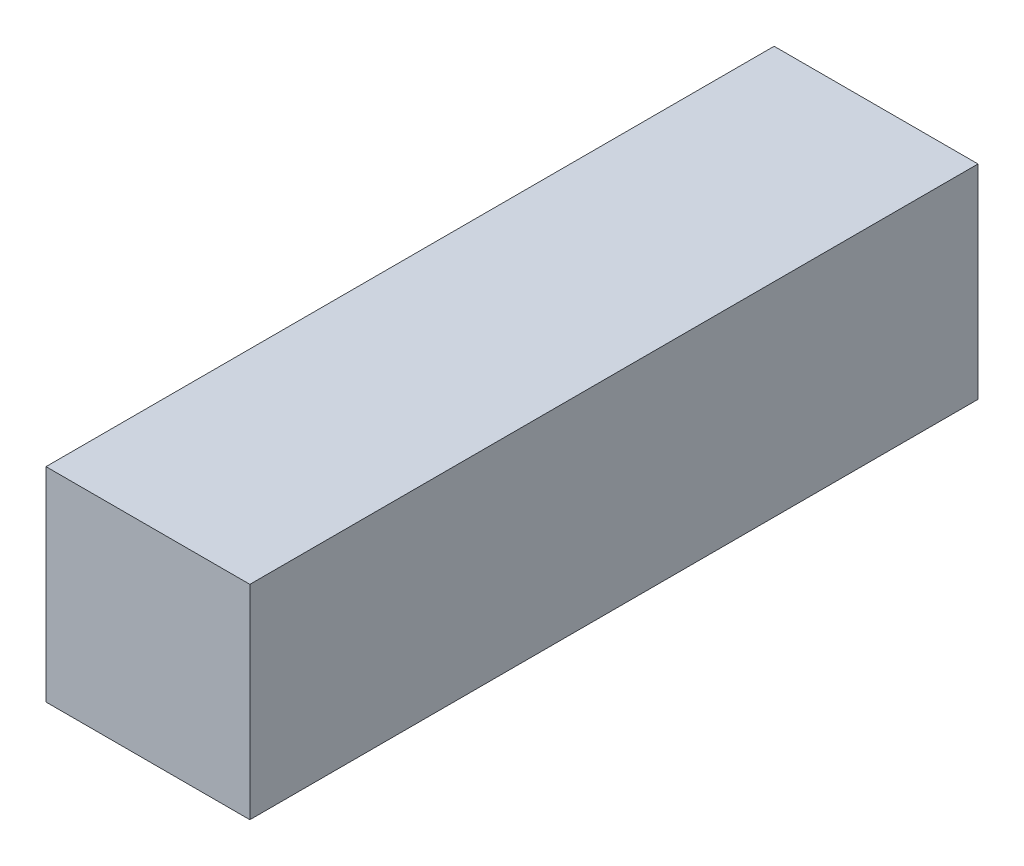
ISO-10303-21;
HEADER;
FILE_DESCRIPTION(('STEP AP214'),'2;1');
FILE_NAME('part.step','',(''),(''),'','','');
FILE_SCHEMA(('AUTOMOTIVE_DESIGN { 1 0 10303 214 1 1 1 1 }'));
ENDSEC;
DATA;
#1=APPLICATION_CONTEXT('core data for automotive mechanical design processes');
#2=APPLICATION_PROTOCOL_DEFINITION('international standard','automotive_design',2000,#1);
#3=PRODUCT_CONTEXT('',#1,'mechanical');
#4=PRODUCT('Part','Part','',(#3));
#5=PRODUCT_RELATED_PRODUCT_CATEGORY('part','',(#4));
#6=PRODUCT_DEFINITION_FORMATION('','',#4);
#7=PRODUCT_DEFINITION_CONTEXT('part definition',#1,'design');
#8=PRODUCT_DEFINITION('design','',#6,#7);
#9=PRODUCT_DEFINITION_SHAPE('','',#8);
#10=(LENGTH_UNIT() NAMED_UNIT(*) SI_UNIT(.MILLI.,.METRE.));
#11=(NAMED_UNIT(*) PLANE_ANGLE_UNIT() SI_UNIT($,.RADIAN.));
#12=(NAMED_UNIT(*) SI_UNIT($,.STERADIAN.) SOLID_ANGLE_UNIT());
#13=UNCERTAINTY_MEASURE_WITH_UNIT(LENGTH_MEASURE(1.E-05),#10,'distance_accuracy_value','');
#14=(GEOMETRIC_REPRESENTATION_CONTEXT(3) GLOBAL_UNCERTAINTY_ASSIGNED_CONTEXT((#13)) GLOBAL_UNIT_ASSIGNED_CONTEXT((#10,
#11,#12)) REPRESENTATION_CONTEXT('',''));
#15=CARTESIAN_POINT('',(0.,0.,0.));
#16=DIRECTION('',(0.,0.,1.));
#17=DIRECTION('',(1.,0.,0.));
#18=AXIS2_PLACEMENT_3D('',#15,#16,#17);
#19=CARTESIAN_POINT('',(13.4132891749905,-3.5610769137091,6.60000000002592));
#20=DIRECTION('',(0.,1.,0.));
#21=DIRECTION('',(0.,0.,1.));
#22=AXIS2_PLACEMENT_3D('',#19,#20,#21);
#23=PLANE('',#22);
#24=DIRECTION('',(1.,0.,0.));
#25=VECTOR('',#24,1.);
#26=CARTESIAN_POINT('',(13.4132891749905,-3.5610769137091,11.6000000000259));
#27=LINE('',#26,#25);
#28=CARTESIAN_POINT('',(13.4132891749905,-3.5610769137091,11.6000000000259));
#29=VERTEX_POINT('',#28);
#30=CARTESIAN_POINT('',(14.8132891511485,-3.5610769137091,11.6000000000259));
#31=VERTEX_POINT('',#30);
#32=EDGE_CURVE('E27',#29,#31,#27,.T.);
#33=ORIENTED_EDGE('',*,*,#32,.T.);
#34=DIRECTION('',(0.,0.,-1.));
#35=VECTOR('',#34,1.);
#36=CARTESIAN_POINT('',(14.8132891511485,-3.5610769137091,6.60000000002592));
#37=LINE('',#36,#35);
#38=CARTESIAN_POINT('',(14.8132891511485,-3.5610769137091,6.60000000002592));
#39=VERTEX_POINT('',#38);
#40=EDGE_CURVE('E11',#31,#39,#37,.T.);
#41=ORIENTED_EDGE('',*,*,#40,.T.);
#42=DIRECTION('',(-1.,0.,0.));
#43=VECTOR('',#42,1.);
#44=CARTESIAN_POINT('',(13.4132891749905,-3.5610769137091,6.60000000002592));
#45=LINE('',#44,#43);
#46=CARTESIAN_POINT('',(13.4132891749905,-3.5610769137091,6.60000000002592));
#47=VERTEX_POINT('',#46);
#48=EDGE_CURVE('E89',#39,#47,#45,.T.);
#49=ORIENTED_EDGE('',*,*,#48,.T.);
#50=DIRECTION('',(0.,0.,1.));
#51=VECTOR('',#50,1.);
#52=CARTESIAN_POINT('',(13.4132891749905,-3.5610769137091,6.60000000002592));
#53=LINE('',#52,#51);
#54=EDGE_CURVE('E83',#47,#29,#53,.T.);
#55=ORIENTED_EDGE('',*,*,#54,.T.);
#56=EDGE_LOOP('',(#33,#41,#49,#55));
#57=FACE_BOUND('',#56,.T.);
#58=ADVANCED_FACE('F16',(#57),#23,.T.);
#59=CARTESIAN_POINT('',(14.8132891511485,-4.9610768898671,6.60000000002592));
#60=DIRECTION('',(1.,0.,0.));
#61=DIRECTION('',(0.,1.,0.));
#62=AXIS2_PLACEMENT_3D('',#59,#60,#61);
#63=PLANE('',#62);
#64=ORIENTED_EDGE('',*,*,#40,.F.);
#65=DIRECTION('',(0.,-1.,0.));
#66=VECTOR('',#65,1.);
#67=CARTESIAN_POINT('',(14.8132891511485,-4.9610768898671,11.6000000000259));
#68=LINE('',#67,#66);
#69=CARTESIAN_POINT('',(14.8132891511485,-4.9610768898671,11.6000000000259));
#70=VERTEX_POINT('',#69);
#71=EDGE_CURVE('E67',#31,#70,#68,.T.);
#72=ORIENTED_EDGE('',*,*,#71,.T.);
#73=DIRECTION('',(0.,0.,-1.));
#74=VECTOR('',#73,1.);
#75=CARTESIAN_POINT('',(14.8132891511485,-4.9610768898671,6.60000000002592));
#76=LINE('',#75,#74);
#77=CARTESIAN_POINT('',(14.8132891511485,-4.9610768898671,6.60000000002592));
#78=VERTEX_POINT('',#77);
#79=EDGE_CURVE('E100',#70,#78,#76,.T.);
#80=ORIENTED_EDGE('',*,*,#79,.T.);
#81=DIRECTION('',(0.,1.,0.));
#82=VECTOR('',#81,1.);
#83=CARTESIAN_POINT('',(14.8132891511485,-4.9610768898671,6.60000000002592));
#84=LINE('',#83,#82);
#85=EDGE_CURVE('E20',#78,#39,#84,.T.);
#86=ORIENTED_EDGE('',*,*,#85,.T.);
#87=EDGE_LOOP('',(#64,#72,#80,#86));
#88=FACE_BOUND('',#87,.T.);
#89=ADVANCED_FACE('F122',(#88),#63,.T.);
#90=CARTESIAN_POINT('',(13.4132891749905,-4.9610768898671,11.6000000000259));
#91=DIRECTION('',(0.,0.,1.));
#92=DIRECTION('',(0.,1.,0.));
#93=AXIS2_PLACEMENT_3D('',#90,#91,#92);
#94=PLANE('',#93);
#95=ORIENTED_EDGE('',*,*,#71,.F.);
#96=ORIENTED_EDGE('',*,*,#32,.F.);
#97=DIRECTION('',(0.,-1.,0.));
#98=VECTOR('',#97,1.);
#99=CARTESIAN_POINT('',(13.4132891749905,-4.9610768898671,11.6000000000259));
#100=LINE('',#99,#98);
#101=CARTESIAN_POINT('',(13.4132891749905,-4.9610768898671,11.6000000000259));
#102=VERTEX_POINT('',#101);
#103=EDGE_CURVE('E55',#29,#102,#100,.T.);
#104=ORIENTED_EDGE('',*,*,#103,.T.);
#105=DIRECTION('',(1.,0.,0.));
#106=VECTOR('',#105,1.);
#107=CARTESIAN_POINT('',(13.4132891749905,-4.9610768898671,11.6000000000259));
#108=LINE('',#107,#106);
#109=EDGE_CURVE('E95',#102,#70,#108,.T.);
#110=ORIENTED_EDGE('',*,*,#109,.T.);
#111=EDGE_LOOP('',(#95,#96,#104,#110));
#112=FACE_BOUND('',#111,.T.);
#113=ADVANCED_FACE('F121',(#112),#94,.T.);
#114=CARTESIAN_POINT('',(13.4132891749905,-4.9610768898671,6.60000000002592));
#115=DIRECTION('',(1.,0.,0.));
#116=DIRECTION('',(0.,1.,0.));
#117=AXIS2_PLACEMENT_3D('',#114,#115,#116);
#118=PLANE('',#117);
#119=DIRECTION('',(0.,0.,-1.));
#120=VECTOR('',#119,1.);
#121=CARTESIAN_POINT('',(13.4132891749905,-4.9610768898671,6.60000000002592));
#122=LINE('',#121,#120);
#123=CARTESIAN_POINT('',(13.4132891749905,-4.9610768898671,6.60000000002592));
#124=VERTEX_POINT('',#123);
#125=EDGE_CURVE('E80',#102,#124,#122,.T.);
#126=ORIENTED_EDGE('',*,*,#125,.F.);
#127=ORIENTED_EDGE('',*,*,#103,.F.);
#128=ORIENTED_EDGE('',*,*,#54,.F.);
#129=DIRECTION('',(0.,1.,0.));
#130=VECTOR('',#129,1.);
#131=CARTESIAN_POINT('',(13.4132891749905,-4.9610768898671,6.60000000002592));
#132=LINE('',#131,#130);
#133=EDGE_CURVE('E78',#124,#47,#132,.T.);
#134=ORIENTED_EDGE('',*,*,#133,.F.);
#135=EDGE_LOOP('',(#126,#127,#128,#134));
#136=FACE_BOUND('',#135,.T.);
#137=ADVANCED_FACE('F18',(#136),#118,.F.);
#138=CARTESIAN_POINT('',(13.4132891749905,-4.9610768898671,6.60000000002592));
#139=DIRECTION('',(0.,0.,1.));
#140=DIRECTION('',(0.,1.,0.));
#141=AXIS2_PLACEMENT_3D('',#138,#139,#140);
#142=PLANE('',#141);
#143=ORIENTED_EDGE('',*,*,#133,.T.);
#144=ORIENTED_EDGE('',*,*,#48,.F.);
#145=ORIENTED_EDGE('',*,*,#85,.F.);
#146=DIRECTION('',(1.,0.,0.));
#147=VECTOR('',#146,1.);
#148=CARTESIAN_POINT('',(13.4132891749905,-4.9610768898671,6.60000000002592));
#149=LINE('',#148,#147);
#150=EDGE_CURVE('E94',#124,#78,#149,.T.);
#151=ORIENTED_EDGE('',*,*,#150,.F.);
#152=EDGE_LOOP('',(#143,#144,#145,#151));
#153=FACE_BOUND('',#152,.T.);
#154=ADVANCED_FACE('F98',(#153),#142,.F.);
#155=CARTESIAN_POINT('',(13.4132891749905,-4.9610768898671,6.60000000002592));
#156=DIRECTION('',(0.,1.,0.));
#157=DIRECTION('',(0.,0.,1.));
#158=AXIS2_PLACEMENT_3D('',#155,#156,#157);
#159=PLANE('',#158);
#160=ORIENTED_EDGE('',*,*,#150,.T.);
#161=ORIENTED_EDGE('',*,*,#79,.F.);
#162=ORIENTED_EDGE('',*,*,#109,.F.);
#163=ORIENTED_EDGE('',*,*,#125,.T.);
#164=EDGE_LOOP('',(#160,#161,#162,#163));
#165=FACE_BOUND('',#164,.T.);
#166=ADVANCED_FACE('F92',(#165),#159,.F.);
#167=CLOSED_SHELL('',(#58,#89,#113,#137,#154,#166));
#168=MANIFOLD_SOLID_BREP('B1',#167);
#169=ADVANCED_BREP_SHAPE_REPRESENTATION('',(#18,#168),#14);
#170=SHAPE_DEFINITION_REPRESENTATION(#9,#169);
ENDSEC;
END-ISO-10303-21;
